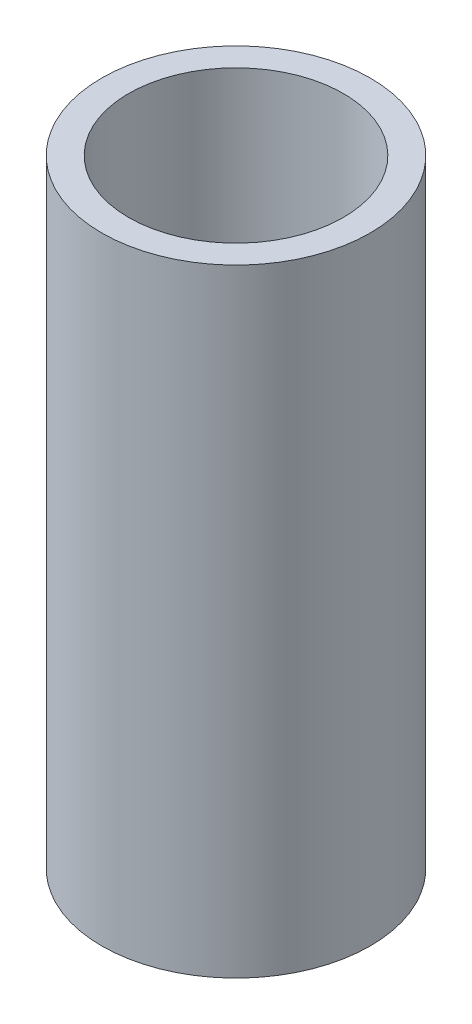
ISO-10303-21;
HEADER;
FILE_DESCRIPTION(('STEP AP214'),'2;1');
FILE_NAME('part.step','',(''),(''),'','','');
FILE_SCHEMA(('AUTOMOTIVE_DESIGN { 1 0 10303 214 1 1 1 1 }'));
ENDSEC;
DATA;
#1=APPLICATION_CONTEXT('core data for automotive mechanical design processes');
#2=APPLICATION_PROTOCOL_DEFINITION('international standard','automotive_design',2000,#1);
#3=PRODUCT_CONTEXT('',#1,'mechanical');
#4=PRODUCT('Part','Part','',(#3));
#5=PRODUCT_RELATED_PRODUCT_CATEGORY('part','',(#4));
#6=PRODUCT_DEFINITION_FORMATION('','',#4);
#7=PRODUCT_DEFINITION_CONTEXT('part definition',#1,'design');
#8=PRODUCT_DEFINITION('design','',#6,#7);
#9=PRODUCT_DEFINITION_SHAPE('','',#8);
#10=(LENGTH_UNIT() NAMED_UNIT(*) SI_UNIT(.MILLI.,.METRE.));
#11=(NAMED_UNIT(*) PLANE_ANGLE_UNIT() SI_UNIT($,.RADIAN.));
#12=(NAMED_UNIT(*) SI_UNIT($,.STERADIAN.) SOLID_ANGLE_UNIT());
#13=UNCERTAINTY_MEASURE_WITH_UNIT(LENGTH_MEASURE(1.E-05),#10,'distance_accuracy_value','');
#14=(GEOMETRIC_REPRESENTATION_CONTEXT(3) GLOBAL_UNCERTAINTY_ASSIGNED_CONTEXT((#13)) GLOBAL_UNIT_ASSIGNED_CONTEXT((#10,
#11,#12)) REPRESENTATION_CONTEXT('',''));
#15=CARTESIAN_POINT('',(0.,0.,0.));
#16=DIRECTION('',(0.,0.,1.));
#17=DIRECTION('',(1.,0.,0.));
#18=AXIS2_PLACEMENT_3D('',#15,#16,#17);
#19=CARTESIAN_POINT('',(0.,23.,0.));
#20=DIRECTION('',(0.,1.,0.));
#21=DIRECTION('',(0.,0.,1.));
#22=AXIS2_PLACEMENT_3D('',#19,#20,#21);
#23=PLANE('',#22);
#24=CARTESIAN_POINT('',(0.,23.,0.));
#25=DIRECTION('',(0.,1.,0.));
#26=DIRECTION('',(0.,0.,1.));
#27=AXIS2_PLACEMENT_3D('',#24,#25,#26);
#28=CIRCLE('',#27,5.);
#29=CARTESIAN_POINT('',(0.,23.,5.));
#30=VERTEX_POINT('',#29);
#31=EDGE_CURVE('E10',#30,#30,#28,.T.);
#32=ORIENTED_EDGE('',*,*,#31,.T.);
#33=EDGE_LOOP('',(#32));
#34=FACE_BOUND('',#33,.T.);
#35=CARTESIAN_POINT('',(0.,23.,0.));
#36=DIRECTION('',(0.,1.,0.));
#37=DIRECTION('',(0.,0.,1.));
#38=AXIS2_PLACEMENT_3D('',#35,#36,#37);
#39=CIRCLE('',#38,4.);
#40=CARTESIAN_POINT('',(0.,23.,4.));
#41=VERTEX_POINT('',#40);
#42=EDGE_CURVE('E42',#41,#41,#39,.T.);
#43=ORIENTED_EDGE('',*,*,#42,.F.);
#44=EDGE_LOOP('',(#43));
#45=FACE_BOUND('',#44,.T.);
#46=ADVANCED_FACE('F31',(#34,#45),#23,.T.);
#47=CARTESIAN_POINT('',(0.,0.,0.));
#48=DIRECTION('',(0.,1.,0.));
#49=DIRECTION('',(0.,0.,1.));
#50=AXIS2_PLACEMENT_3D('',#47,#48,#49);
#51=PLANE('',#50);
#52=CARTESIAN_POINT('',(0.,0.,0.));
#53=DIRECTION('',(0.,1.,0.));
#54=DIRECTION('',(0.,0.,1.));
#55=AXIS2_PLACEMENT_3D('',#52,#53,#54);
#56=CIRCLE('',#55,5.);
#57=CARTESIAN_POINT('',(0.,0.,5.));
#58=VERTEX_POINT('',#57);
#59=EDGE_CURVE('E35',#58,#58,#56,.T.);
#60=ORIENTED_EDGE('',*,*,#59,.F.);
#61=EDGE_LOOP('',(#60));
#62=FACE_BOUND('',#61,.T.);
#63=CARTESIAN_POINT('',(0.,0.,0.));
#64=DIRECTION('',(0.,1.,0.));
#65=DIRECTION('',(0.,0.,1.));
#66=AXIS2_PLACEMENT_3D('',#63,#64,#65);
#67=CIRCLE('',#66,4.);
#68=CARTESIAN_POINT('',(0.,0.,4.));
#69=VERTEX_POINT('',#68);
#70=EDGE_CURVE('E44',#69,#69,#67,.T.);
#71=ORIENTED_EDGE('',*,*,#70,.T.);
#72=EDGE_LOOP('',(#71));
#73=FACE_BOUND('',#72,.T.);
#74=ADVANCED_FACE('F54',(#62,#73),#51,.F.);
#75=CARTESIAN_POINT('',(0.,23.,0.));
#76=DIRECTION('',(0.,-1.,0.));
#77=DIRECTION('',(0.,0.,-1.));
#78=AXIS2_PLACEMENT_3D('',#75,#76,#77);
#79=CYLINDRICAL_SURFACE('',#78,5.);
#80=ORIENTED_EDGE('',*,*,#31,.F.);
#81=EDGE_LOOP('',(#80));
#82=FACE_BOUND('',#81,.T.);
#83=ORIENTED_EDGE('',*,*,#59,.T.);
#84=EDGE_LOOP('',(#83));
#85=FACE_BOUND('',#84,.T.);
#86=ADVANCED_FACE('F33',(#82,#85),#79,.T.);
#87=CARTESIAN_POINT('',(0.,23.,0.));
#88=DIRECTION('',(0.,-1.,0.));
#89=DIRECTION('',(0.,0.,-1.));
#90=AXIS2_PLACEMENT_3D('',#87,#88,#89);
#91=CYLINDRICAL_SURFACE('',#90,4.);
#92=ORIENTED_EDGE('',*,*,#42,.T.);
#93=EDGE_LOOP('',(#92));
#94=FACE_BOUND('',#93,.T.);
#95=ORIENTED_EDGE('',*,*,#70,.F.);
#96=EDGE_LOOP('',(#95));
#97=FACE_BOUND('',#96,.T.);
#98=ADVANCED_FACE('F50',(#94,#97),#91,.F.);
#99=CLOSED_SHELL('',(#46,#74,#86,#98));
#100=MANIFOLD_SOLID_BREP('B2',#99);
#101=ADVANCED_BREP_SHAPE_REPRESENTATION('',(#18,#100),#14);
#102=SHAPE_DEFINITION_REPRESENTATION(#9,#101);
ENDSEC;
END-ISO-10303-21;
